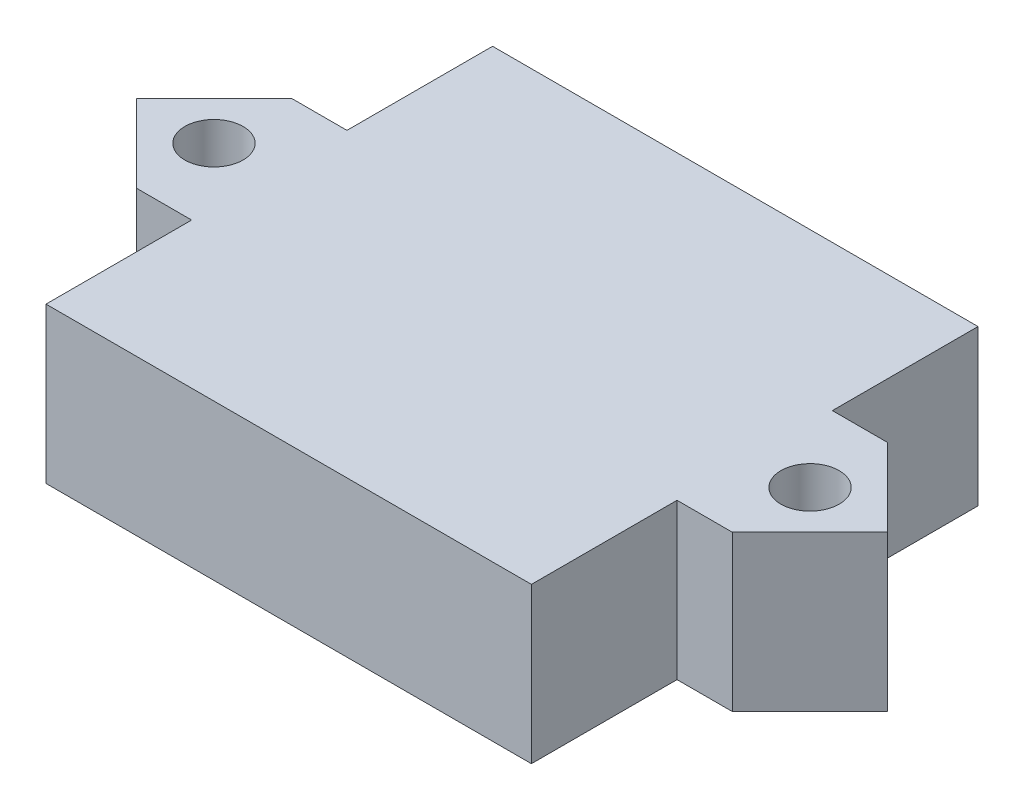
ISO-10303-21;
HEADER;
FILE_DESCRIPTION(('STEP AP214'),'2;1');
FILE_NAME('part.step','',(''),(''),'','','');
FILE_SCHEMA(('AUTOMOTIVE_DESIGN { 1 0 10303 214 1 1 1 1 }'));
ENDSEC;
DATA;
#1=APPLICATION_CONTEXT('core data for automotive mechanical design processes');
#2=APPLICATION_PROTOCOL_DEFINITION('international standard','automotive_design',2000,#1);
#3=PRODUCT_CONTEXT('',#1,'mechanical');
#4=PRODUCT('Part','Part','',(#3));
#5=PRODUCT_RELATED_PRODUCT_CATEGORY('part','',(#4));
#6=PRODUCT_DEFINITION_FORMATION('','',#4);
#7=PRODUCT_DEFINITION_CONTEXT('part definition',#1,'design');
#8=PRODUCT_DEFINITION('design','',#6,#7);
#9=PRODUCT_DEFINITION_SHAPE('','',#8);
#10=(LENGTH_UNIT() NAMED_UNIT(*) SI_UNIT(.MILLI.,.METRE.));
#11=(NAMED_UNIT(*) PLANE_ANGLE_UNIT() SI_UNIT($,.RADIAN.));
#12=(NAMED_UNIT(*) SI_UNIT($,.STERADIAN.) SOLID_ANGLE_UNIT());
#13=UNCERTAINTY_MEASURE_WITH_UNIT(LENGTH_MEASURE(1.E-05),#10,'distance_accuracy_value','');
#14=(GEOMETRIC_REPRESENTATION_CONTEXT(3) GLOBAL_UNCERTAINTY_ASSIGNED_CONTEXT((#13)) GLOBAL_UNIT_ASSIGNED_CONTEXT((#10,
#11,#12)) REPRESENTATION_CONTEXT('',''));
#15=CARTESIAN_POINT('',(0.,0.,0.));
#16=DIRECTION('',(0.,0.,1.));
#17=DIRECTION('',(1.,0.,0.));
#18=AXIS2_PLACEMENT_3D('',#15,#16,#17);
#19=CARTESIAN_POINT('',(0.,8.,0.));
#20=DIRECTION('',(0.,1.,0.));
#21=DIRECTION('',(0.,0.,1.));
#22=AXIS2_PLACEMENT_3D('',#19,#20,#21);
#23=PLANE('',#22);
#24=CARTESIAN_POINT('',(-15.35,8.,0.));
#25=DIRECTION('',(0.,1.,0.));
#26=DIRECTION('',(0.,0.,1.));
#27=AXIS2_PLACEMENT_3D('',#24,#25,#26);
#28=CIRCLE('',#27,1.5);
#29=CARTESIAN_POINT('',(-15.35,8.,1.5));
#30=VERTEX_POINT('',#29);
#31=EDGE_CURVE('E179',#30,#30,#28,.T.);
#32=ORIENTED_EDGE('',*,*,#31,.F.);
#33=EDGE_LOOP('',(#32));
#34=FACE_BOUND('',#33,.T.);
#35=DIRECTION('',(-0.707106781186548,0.,0.707106781186547));
#36=VECTOR('',#35,1.);
#37=CARTESIAN_POINT('',(-15.35,8.,-4.));
#38=LINE('',#37,#36);
#39=CARTESIAN_POINT('',(-15.35,8.,-4.));
#40=VERTEX_POINT('',#39);
#41=CARTESIAN_POINT('',(-19.35,8.,0.));
#42=VERTEX_POINT('',#41);
#43=EDGE_CURVE('E203',#40,#42,#38,.T.);
#44=ORIENTED_EDGE('',*,*,#43,.T.);
#45=DIRECTION('',(0.707106781186548,0.,0.707106781186547));
#46=VECTOR('',#45,1.);
#47=CARTESIAN_POINT('',(-19.35,8.,0.));
#48=LINE('',#47,#46);
#49=CARTESIAN_POINT('',(-15.35,8.,4.));
#50=VERTEX_POINT('',#49);
#51=EDGE_CURVE('E239',#42,#50,#48,.T.);
#52=ORIENTED_EDGE('',*,*,#51,.T.);
#53=DIRECTION('',(1.,0.,0.));
#54=VECTOR('',#53,1.);
#55=CARTESIAN_POINT('',(-15.35,8.,4.));
#56=LINE('',#55,#54);
#57=CARTESIAN_POINT('',(-12.5,8.,4.));
#58=VERTEX_POINT('',#57);
#59=EDGE_CURVE('E233',#50,#58,#56,.T.);
#60=ORIENTED_EDGE('',*,*,#59,.T.);
#61=DIRECTION('',(0.,0.,1.));
#62=VECTOR('',#61,1.);
#63=CARTESIAN_POINT('',(-12.5,8.,4.));
#64=LINE('',#63,#62);
#65=CARTESIAN_POINT('',(-12.5,8.,11.5));
#66=VERTEX_POINT('',#65);
#67=EDGE_CURVE('E231',#58,#66,#64,.T.);
#68=ORIENTED_EDGE('',*,*,#67,.T.);
#69=DIRECTION('',(1.,0.,0.));
#70=VECTOR('',#69,1.);
#71=CARTESIAN_POINT('',(-12.5,8.,11.5));
#72=LINE('',#71,#70);
#73=CARTESIAN_POINT('',(12.5,8.,11.5));
#74=VERTEX_POINT('',#73);
#75=EDGE_CURVE('E121',#66,#74,#72,.T.);
#76=ORIENTED_EDGE('',*,*,#75,.T.);
#77=DIRECTION('',(0.,0.,-1.));
#78=VECTOR('',#77,1.);
#79=CARTESIAN_POINT('',(12.5,8.,12.5));
#80=LINE('',#79,#78);
#81=CARTESIAN_POINT('',(12.5,8.,4.));
#82=VERTEX_POINT('',#81);
#83=EDGE_CURVE('E130',#74,#82,#80,.T.);
#84=ORIENTED_EDGE('',*,*,#83,.T.);
#85=DIRECTION('',(1.,0.,0.));
#86=VECTOR('',#85,1.);
#87=CARTESIAN_POINT('',(12.5,8.,4.));
#88=LINE('',#87,#86);
#89=CARTESIAN_POINT('',(15.35,8.,4.));
#90=VERTEX_POINT('',#89);
#91=EDGE_CURVE('E232',#82,#90,#88,.T.);
#92=ORIENTED_EDGE('',*,*,#91,.T.);
#93=DIRECTION('',(0.707106781186548,0.,-0.707106781186547));
#94=VECTOR('',#93,1.);
#95=CARTESIAN_POINT('',(15.35,8.,4.));
#96=LINE('',#95,#94);
#97=CARTESIAN_POINT('',(19.35,8.,0.));
#98=VERTEX_POINT('',#97);
#99=EDGE_CURVE('E244',#90,#98,#96,.T.);
#100=ORIENTED_EDGE('',*,*,#99,.T.);
#101=DIRECTION('',(-0.707106781186548,0.,-0.707106781186547));
#102=VECTOR('',#101,1.);
#103=CARTESIAN_POINT('',(19.35,8.,0.));
#104=LINE('',#103,#102);
#105=CARTESIAN_POINT('',(15.35,8.,-4.));
#106=VERTEX_POINT('',#105);
#107=EDGE_CURVE('E150',#98,#106,#104,.T.);
#108=ORIENTED_EDGE('',*,*,#107,.T.);
#109=DIRECTION('',(-1.,0.,0.));
#110=VECTOR('',#109,1.);
#111=CARTESIAN_POINT('',(15.35,8.,-4.));
#112=LINE('',#111,#110);
#113=CARTESIAN_POINT('',(12.5,8.,-4.));
#114=VERTEX_POINT('',#113);
#115=EDGE_CURVE('E140',#106,#114,#112,.T.);
#116=ORIENTED_EDGE('',*,*,#115,.T.);
#117=DIRECTION('',(0.,0.,-1.));
#118=VECTOR('',#117,1.);
#119=CARTESIAN_POINT('',(12.5,8.,-4.));
#120=LINE('',#119,#118);
#121=CARTESIAN_POINT('',(12.5,8.,-11.5));
#122=VERTEX_POINT('',#121);
#123=EDGE_CURVE('E145',#114,#122,#120,.T.);
#124=ORIENTED_EDGE('',*,*,#123,.T.);
#125=DIRECTION('',(-1.,0.,0.));
#126=VECTOR('',#125,1.);
#127=CARTESIAN_POINT('',(12.5,8.,-11.5));
#128=LINE('',#127,#126);
#129=CARTESIAN_POINT('',(-12.5,8.,-11.5));
#130=VERTEX_POINT('',#129);
#131=EDGE_CURVE('E164',#122,#130,#128,.T.);
#132=ORIENTED_EDGE('',*,*,#131,.T.);
#133=DIRECTION('',(0.,0.,1.));
#134=VECTOR('',#133,1.);
#135=CARTESIAN_POINT('',(-12.5,8.,-12.5));
#136=LINE('',#135,#134);
#137=CARTESIAN_POINT('',(-12.5,8.,-4.));
#138=VERTEX_POINT('',#137);
#139=EDGE_CURVE('E170',#130,#138,#136,.T.);
#140=ORIENTED_EDGE('',*,*,#139,.T.);
#141=DIRECTION('',(-1.,0.,0.));
#142=VECTOR('',#141,1.);
#143=CARTESIAN_POINT('',(-12.5,8.,-4.));
#144=LINE('',#143,#142);
#145=EDGE_CURVE('E63',#138,#40,#144,.T.);
#146=ORIENTED_EDGE('',*,*,#145,.T.);
#147=EDGE_LOOP('',(#44,#52,#60,#68,#76,#84,#92,#100,#108,#116,#124,#132,#140,#146));
#148=FACE_BOUND('',#147,.T.);
#149=CARTESIAN_POINT('',(15.35,8.,0.));
#150=DIRECTION('',(0.,1.,0.));
#151=DIRECTION('',(0.,0.,1.));
#152=AXIS2_PLACEMENT_3D('',#149,#150,#151);
#153=CIRCLE('',#152,1.5);
#154=CARTESIAN_POINT('',(15.35,8.,1.5));
#155=VERTEX_POINT('',#154);
#156=EDGE_CURVE('E283',#155,#155,#153,.T.);
#157=ORIENTED_EDGE('',*,*,#156,.F.);
#158=EDGE_LOOP('',(#157));
#159=FACE_BOUND('',#158,.T.);
#160=ADVANCED_FACE('F45',(#34,#148,#159),#23,.T.);
#161=CARTESIAN_POINT('',(0.,0.,0.));
#162=DIRECTION('',(0.,1.,0.));
#163=DIRECTION('',(0.,0.,1.));
#164=AXIS2_PLACEMENT_3D('',#161,#162,#163);
#165=PLANE('',#164);
#166=DIRECTION('',(-0.707106781186548,0.,0.707106781186547));
#167=VECTOR('',#166,1.);
#168=CARTESIAN_POINT('',(-15.35,0.,-4.));
#169=LINE('',#168,#167);
#170=CARTESIAN_POINT('',(-15.35,0.,-4.));
#171=VERTEX_POINT('',#170);
#172=CARTESIAN_POINT('',(-19.35,0.,0.));
#173=VERTEX_POINT('',#172);
#174=EDGE_CURVE('E174',#171,#173,#169,.T.);
#175=ORIENTED_EDGE('',*,*,#174,.F.);
#176=DIRECTION('',(-1.,0.,0.));
#177=VECTOR('',#176,1.);
#178=CARTESIAN_POINT('',(-12.5,0.,-4.));
#179=LINE('',#178,#177);
#180=CARTESIAN_POINT('',(-12.5,0.,-4.));
#181=VERTEX_POINT('',#180);
#182=EDGE_CURVE('E200',#181,#171,#179,.T.);
#183=ORIENTED_EDGE('',*,*,#182,.F.);
#184=DIRECTION('',(0.,0.,1.));
#185=VECTOR('',#184,1.);
#186=CARTESIAN_POINT('',(-12.5,0.,-12.5));
#187=LINE('',#186,#185);
#188=CARTESIAN_POINT('',(-12.5,0.,-11.5));
#189=VERTEX_POINT('',#188);
#190=EDGE_CURVE('E197',#189,#181,#187,.T.);
#191=ORIENTED_EDGE('',*,*,#190,.F.);
#192=DIRECTION('',(-1.,0.,0.));
#193=VECTOR('',#192,1.);
#194=CARTESIAN_POINT('',(12.5,0.,-11.5));
#195=LINE('',#194,#193);
#196=CARTESIAN_POINT('',(12.5,0.,-11.5));
#197=VERTEX_POINT('',#196);
#198=EDGE_CURVE('E198',#197,#189,#195,.T.);
#199=ORIENTED_EDGE('',*,*,#198,.F.);
#200=DIRECTION('',(0.,0.,-1.));
#201=VECTOR('',#200,1.);
#202=CARTESIAN_POINT('',(12.5,0.,-4.));
#203=LINE('',#202,#201);
#204=CARTESIAN_POINT('',(12.5,0.,-4.));
#205=VERTEX_POINT('',#204);
#206=EDGE_CURVE('E193',#205,#197,#203,.T.);
#207=ORIENTED_EDGE('',*,*,#206,.F.);
#208=DIRECTION('',(-1.,0.,0.));
#209=VECTOR('',#208,1.);
#210=CARTESIAN_POINT('',(15.35,0.,-4.));
#211=LINE('',#210,#209);
#212=CARTESIAN_POINT('',(15.35,0.,-4.));
#213=VERTEX_POINT('',#212);
#214=EDGE_CURVE('E156',#213,#205,#211,.T.);
#215=ORIENTED_EDGE('',*,*,#214,.F.);
#216=DIRECTION('',(-0.707106781186548,0.,-0.707106781186547));
#217=VECTOR('',#216,1.);
#218=CARTESIAN_POINT('',(19.35,0.,0.));
#219=LINE('',#218,#217);
#220=CARTESIAN_POINT('',(19.35,0.,0.));
#221=VERTEX_POINT('',#220);
#222=EDGE_CURVE('E191',#221,#213,#219,.T.);
#223=ORIENTED_EDGE('',*,*,#222,.F.);
#224=DIRECTION('',(0.707106781186548,0.,-0.707106781186547));
#225=VECTOR('',#224,1.);
#226=CARTESIAN_POINT('',(15.35,0.,4.));
#227=LINE('',#226,#225);
#228=CARTESIAN_POINT('',(15.35,0.,4.));
#229=VERTEX_POINT('',#228);
#230=EDGE_CURVE('E189',#229,#221,#227,.T.);
#231=ORIENTED_EDGE('',*,*,#230,.F.);
#232=DIRECTION('',(1.,0.,0.));
#233=VECTOR('',#232,1.);
#234=CARTESIAN_POINT('',(12.5,0.,4.));
#235=LINE('',#234,#233);
#236=CARTESIAN_POINT('',(12.5,0.,4.));
#237=VERTEX_POINT('',#236);
#238=EDGE_CURVE('E190',#237,#229,#235,.T.);
#239=ORIENTED_EDGE('',*,*,#238,.F.);
#240=DIRECTION('',(0.,0.,-1.));
#241=VECTOR('',#240,1.);
#242=CARTESIAN_POINT('',(12.5,0.,12.5));
#243=LINE('',#242,#241);
#244=CARTESIAN_POINT('',(12.5,0.,11.5));
#245=VERTEX_POINT('',#244);
#246=EDGE_CURVE('E183',#245,#237,#243,.T.);
#247=ORIENTED_EDGE('',*,*,#246,.F.);
#248=DIRECTION('',(1.,0.,0.));
#249=VECTOR('',#248,1.);
#250=CARTESIAN_POINT('',(-12.5,0.,11.5));
#251=LINE('',#250,#249);
#252=CARTESIAN_POINT('',(-12.5,0.,11.5));
#253=VERTEX_POINT('',#252);
#254=EDGE_CURVE('E184',#253,#245,#251,.T.);
#255=ORIENTED_EDGE('',*,*,#254,.F.);
#256=DIRECTION('',(0.,0.,1.));
#257=VECTOR('',#256,1.);
#258=CARTESIAN_POINT('',(-12.5,0.,4.));
#259=LINE('',#258,#257);
#260=CARTESIAN_POINT('',(-12.5,0.,4.));
#261=VERTEX_POINT('',#260);
#262=EDGE_CURVE('E185',#261,#253,#259,.T.);
#263=ORIENTED_EDGE('',*,*,#262,.F.);
#264=DIRECTION('',(1.,0.,0.));
#265=VECTOR('',#264,1.);
#266=CARTESIAN_POINT('',(-15.35,0.,4.));
#267=LINE('',#266,#265);
#268=CARTESIAN_POINT('',(-15.35,0.,4.));
#269=VERTEX_POINT('',#268);
#270=EDGE_CURVE('E180',#269,#261,#267,.T.);
#271=ORIENTED_EDGE('',*,*,#270,.F.);
#272=DIRECTION('',(0.707106781186548,0.,0.707106781186547));
#273=VECTOR('',#272,1.);
#274=CARTESIAN_POINT('',(-19.35,0.,0.));
#275=LINE('',#274,#273);
#276=EDGE_CURVE('E177',#173,#269,#275,.T.);
#277=ORIENTED_EDGE('',*,*,#276,.F.);
#278=EDGE_LOOP('',(#175,#183,#191,#199,#207,#215,#223,#231,#239,#247,#255,#263,#271,#277));
#279=FACE_BOUND('',#278,.T.);
#280=CARTESIAN_POINT('',(-15.35,0.,0.));
#281=DIRECTION('',(0.,1.,0.));
#282=DIRECTION('',(0.,0.,1.));
#283=AXIS2_PLACEMENT_3D('',#280,#281,#282);
#284=CIRCLE('',#283,1.5);
#285=CARTESIAN_POINT('',(-15.35,0.,1.5));
#286=VERTEX_POINT('',#285);
#287=EDGE_CURVE('E279',#286,#286,#284,.T.);
#288=ORIENTED_EDGE('',*,*,#287,.T.);
#289=EDGE_LOOP('',(#288));
#290=FACE_BOUND('',#289,.T.);
#291=CARTESIAN_POINT('',(15.35,0.,0.));
#292=DIRECTION('',(0.,1.,0.));
#293=DIRECTION('',(0.,0.,1.));
#294=AXIS2_PLACEMENT_3D('',#291,#292,#293);
#295=CIRCLE('',#294,1.5);
#296=CARTESIAN_POINT('',(15.35,0.,1.5));
#297=VERTEX_POINT('',#296);
#298=EDGE_CURVE('E284',#297,#297,#295,.T.);
#299=ORIENTED_EDGE('',*,*,#298,.T.);
#300=EDGE_LOOP('',(#299));
#301=FACE_BOUND('',#300,.T.);
#302=ADVANCED_FACE('F260',(#279,#290,#301),#165,.F.);
#303=CARTESIAN_POINT('',(-15.35,8.,-4.));
#304=DIRECTION('',(0.707106781186547,0.,0.707106781186548));
#305=DIRECTION('',(0.707106781186548,0.,-0.707106781186547));
#306=AXIS2_PLACEMENT_3D('',#303,#304,#305);
#307=PLANE('',#306);
#308=ORIENTED_EDGE('',*,*,#174,.T.);
#309=DIRECTION('',(0.,-1.,0.));
#310=VECTOR('',#309,1.);
#311=CARTESIAN_POINT('',(-19.35,8.,0.));
#312=LINE('',#311,#310);
#313=EDGE_CURVE('E12',#42,#173,#312,.T.);
#314=ORIENTED_EDGE('',*,*,#313,.F.);
#315=ORIENTED_EDGE('',*,*,#43,.F.);
#316=DIRECTION('',(0.,-1.,0.));
#317=VECTOR('',#316,1.);
#318=CARTESIAN_POINT('',(-15.35,8.,-4.));
#319=LINE('',#318,#317);
#320=EDGE_CURVE('E171',#40,#171,#319,.T.);
#321=ORIENTED_EDGE('',*,*,#320,.T.);
#322=EDGE_LOOP('',(#308,#314,#315,#321));
#323=FACE_BOUND('',#322,.T.);
#324=ADVANCED_FACE('F273',(#323),#307,.F.);
#325=CARTESIAN_POINT('',(-19.35,8.,0.));
#326=DIRECTION('',(0.707106781186547,0.,-0.707106781186548));
#327=DIRECTION('',(-0.707106781186548,0.,-0.707106781186547));
#328=AXIS2_PLACEMENT_3D('',#325,#326,#327);
#329=PLANE('',#328);
#330=ORIENTED_EDGE('',*,*,#276,.T.);
#331=DIRECTION('',(0.,-1.,0.));
#332=VECTOR('',#331,1.);
#333=CARTESIAN_POINT('',(-15.35,8.,4.));
#334=LINE('',#333,#332);
#335=EDGE_CURVE('E55',#50,#269,#334,.T.);
#336=ORIENTED_EDGE('',*,*,#335,.F.);
#337=ORIENTED_EDGE('',*,*,#51,.F.);
#338=ORIENTED_EDGE('',*,*,#313,.T.);
#339=EDGE_LOOP('',(#330,#336,#337,#338));
#340=FACE_BOUND('',#339,.T.);
#341=ADVANCED_FACE('F335',(#340),#329,.F.);
#342=CARTESIAN_POINT('',(-15.35,8.,4.));
#343=DIRECTION('',(0.,0.,-1.));
#344=DIRECTION('',(-1.,0.,0.));
#345=AXIS2_PLACEMENT_3D('',#342,#343,#344);
#346=PLANE('',#345);
#347=ORIENTED_EDGE('',*,*,#270,.T.);
#348=DIRECTION('',(0.,-1.,0.));
#349=VECTOR('',#348,1.);
#350=CARTESIAN_POINT('',(-12.5,8.,4.));
#351=LINE('',#350,#349);
#352=EDGE_CURVE('E217',#58,#261,#351,.T.);
#353=ORIENTED_EDGE('',*,*,#352,.F.);
#354=ORIENTED_EDGE('',*,*,#59,.F.);
#355=ORIENTED_EDGE('',*,*,#335,.T.);
#356=EDGE_LOOP('',(#347,#353,#354,#355));
#357=FACE_BOUND('',#356,.T.);
#358=ADVANCED_FACE('F327',(#357),#346,.F.);
#359=CARTESIAN_POINT('',(-12.5,8.,4.));
#360=DIRECTION('',(1.,0.,0.));
#361=DIRECTION('',(0.,0.,-1.));
#362=AXIS2_PLACEMENT_3D('',#359,#360,#361);
#363=PLANE('',#362);
#364=ORIENTED_EDGE('',*,*,#262,.T.);
#365=DIRECTION('',(0.,-1.,0.));
#366=VECTOR('',#365,1.);
#367=CARTESIAN_POINT('',(-12.5,8.,11.5));
#368=LINE('',#367,#366);
#369=EDGE_CURVE('E222',#66,#253,#368,.T.);
#370=ORIENTED_EDGE('',*,*,#369,.F.);
#371=ORIENTED_EDGE('',*,*,#67,.F.);
#372=ORIENTED_EDGE('',*,*,#352,.T.);
#373=EDGE_LOOP('',(#364,#370,#371,#372));
#374=FACE_BOUND('',#373,.T.);
#375=ADVANCED_FACE('F324',(#374),#363,.F.);
#376=CARTESIAN_POINT('',(-12.5,8.,11.5));
#377=DIRECTION('',(0.,0.,-1.));
#378=DIRECTION('',(-1.,0.,0.));
#379=AXIS2_PLACEMENT_3D('',#376,#377,#378);
#380=PLANE('',#379);
#381=ORIENTED_EDGE('',*,*,#254,.T.);
#382=DIRECTION('',(0.,-1.,0.));
#383=VECTOR('',#382,1.);
#384=CARTESIAN_POINT('',(12.5,8.,11.5));
#385=LINE('',#384,#383);
#386=EDGE_CURVE('E46',#74,#245,#385,.T.);
#387=ORIENTED_EDGE('',*,*,#386,.F.);
#388=ORIENTED_EDGE('',*,*,#75,.F.);
#389=ORIENTED_EDGE('',*,*,#369,.T.);
#390=EDGE_LOOP('',(#381,#387,#388,#389));
#391=FACE_BOUND('',#390,.T.);
#392=ADVANCED_FACE('F42',(#391),#380,.F.);
#393=CARTESIAN_POINT('',(12.5,8.,12.5));
#394=DIRECTION('',(-1.,0.,0.));
#395=DIRECTION('',(0.,0.,1.));
#396=AXIS2_PLACEMENT_3D('',#393,#394,#395);
#397=PLANE('',#396);
#398=ORIENTED_EDGE('',*,*,#246,.T.);
#399=DIRECTION('',(0.,-1.,0.));
#400=VECTOR('',#399,1.);
#401=CARTESIAN_POINT('',(12.5,8.,4.));
#402=LINE('',#401,#400);
#403=EDGE_CURVE('E214',#82,#237,#402,.T.);
#404=ORIENTED_EDGE('',*,*,#403,.F.);
#405=ORIENTED_EDGE('',*,*,#83,.F.);
#406=ORIENTED_EDGE('',*,*,#386,.T.);
#407=EDGE_LOOP('',(#398,#404,#405,#406));
#408=FACE_BOUND('',#407,.T.);
#409=ADVANCED_FACE('F319',(#408),#397,.F.);
#410=CARTESIAN_POINT('',(12.5,8.,4.));
#411=DIRECTION('',(0.,0.,-1.));
#412=DIRECTION('',(-1.,0.,0.));
#413=AXIS2_PLACEMENT_3D('',#410,#411,#412);
#414=PLANE('',#413);
#415=ORIENTED_EDGE('',*,*,#238,.T.);
#416=DIRECTION('',(0.,-1.,0.));
#417=VECTOR('',#416,1.);
#418=CARTESIAN_POINT('',(15.35,8.,4.));
#419=LINE('',#418,#417);
#420=EDGE_CURVE('E215',#90,#229,#419,.T.);
#421=ORIENTED_EDGE('',*,*,#420,.F.);
#422=ORIENTED_EDGE('',*,*,#91,.F.);
#423=ORIENTED_EDGE('',*,*,#403,.T.);
#424=EDGE_LOOP('',(#415,#421,#422,#423));
#425=FACE_BOUND('',#424,.T.);
#426=ADVANCED_FACE('F320',(#425),#414,.F.);
#427=CARTESIAN_POINT('',(15.35,8.,4.));
#428=DIRECTION('',(-0.707106781186547,0.,-0.707106781186548));
#429=DIRECTION('',(-0.707106781186548,0.,0.707106781186547));
#430=AXIS2_PLACEMENT_3D('',#427,#428,#429);
#431=PLANE('',#430);
#432=ORIENTED_EDGE('',*,*,#230,.T.);
#433=DIRECTION('',(0.,-1.,0.));
#434=VECTOR('',#433,1.);
#435=CARTESIAN_POINT('',(19.35,8.,0.));
#436=LINE('',#435,#434);
#437=EDGE_CURVE('E207',#98,#221,#436,.T.);
#438=ORIENTED_EDGE('',*,*,#437,.F.);
#439=ORIENTED_EDGE('',*,*,#99,.F.);
#440=ORIENTED_EDGE('',*,*,#420,.T.);
#441=EDGE_LOOP('',(#432,#438,#439,#440));
#442=FACE_BOUND('',#441,.T.);
#443=ADVANCED_FACE('F250',(#442),#431,.F.);
#444=CARTESIAN_POINT('',(19.35,8.,0.));
#445=DIRECTION('',(-0.707106781186547,0.,0.707106781186548));
#446=DIRECTION('',(0.707106781186548,0.,0.707106781186547));
#447=AXIS2_PLACEMENT_3D('',#444,#445,#446);
#448=PLANE('',#447);
#449=ORIENTED_EDGE('',*,*,#222,.T.);
#450=DIRECTION('',(0.,-1.,0.));
#451=VECTOR('',#450,1.);
#452=CARTESIAN_POINT('',(15.35,8.,-4.));
#453=LINE('',#452,#451);
#454=EDGE_CURVE('E157',#106,#213,#453,.T.);
#455=ORIENTED_EDGE('',*,*,#454,.F.);
#456=ORIENTED_EDGE('',*,*,#107,.F.);
#457=ORIENTED_EDGE('',*,*,#437,.T.);
#458=EDGE_LOOP('',(#449,#455,#456,#457));
#459=FACE_BOUND('',#458,.T.);
#460=ADVANCED_FACE('F255',(#459),#448,.F.);
#461=CARTESIAN_POINT('',(15.35,8.,-4.));
#462=DIRECTION('',(0.,0.,1.));
#463=DIRECTION('',(1.,0.,0.));
#464=AXIS2_PLACEMENT_3D('',#461,#462,#463);
#465=PLANE('',#464);
#466=ORIENTED_EDGE('',*,*,#214,.T.);
#467=DIRECTION('',(0.,-1.,0.));
#468=VECTOR('',#467,1.);
#469=CARTESIAN_POINT('',(12.5,8.,-4.));
#470=LINE('',#469,#468);
#471=EDGE_CURVE('E153',#114,#205,#470,.T.);
#472=ORIENTED_EDGE('',*,*,#471,.F.);
#473=ORIENTED_EDGE('',*,*,#115,.F.);
#474=ORIENTED_EDGE('',*,*,#454,.T.);
#475=EDGE_LOOP('',(#466,#472,#473,#474));
#476=FACE_BOUND('',#475,.T.);
#477=ADVANCED_FACE('F152',(#476),#465,.F.);
#478=CARTESIAN_POINT('',(12.5,8.,-4.));
#479=DIRECTION('',(-1.,0.,0.));
#480=DIRECTION('',(0.,0.,1.));
#481=AXIS2_PLACEMENT_3D('',#478,#479,#480);
#482=PLANE('',#481);
#483=ORIENTED_EDGE('',*,*,#206,.T.);
#484=DIRECTION('',(0.,-1.,0.));
#485=VECTOR('',#484,1.);
#486=CARTESIAN_POINT('',(12.5,8.,-11.5));
#487=LINE('',#486,#485);
#488=EDGE_CURVE('E159',#122,#197,#487,.T.);
#489=ORIENTED_EDGE('',*,*,#488,.F.);
#490=ORIENTED_EDGE('',*,*,#123,.F.);
#491=ORIENTED_EDGE('',*,*,#471,.T.);
#492=EDGE_LOOP('',(#483,#489,#490,#491));
#493=FACE_BOUND('',#492,.T.);
#494=ADVANCED_FACE('F165',(#493),#482,.F.);
#495=CARTESIAN_POINT('',(12.5,8.,-11.5));
#496=DIRECTION('',(0.,0.,1.));
#497=DIRECTION('',(1.,0.,0.));
#498=AXIS2_PLACEMENT_3D('',#495,#496,#497);
#499=PLANE('',#498);
#500=ORIENTED_EDGE('',*,*,#198,.T.);
#501=DIRECTION('',(0.,-1.,0.));
#502=VECTOR('',#501,1.);
#503=CARTESIAN_POINT('',(-12.5,8.,-11.5));
#504=LINE('',#503,#502);
#505=EDGE_CURVE('E206',#130,#189,#504,.T.);
#506=ORIENTED_EDGE('',*,*,#505,.F.);
#507=ORIENTED_EDGE('',*,*,#131,.F.);
#508=ORIENTED_EDGE('',*,*,#488,.T.);
#509=EDGE_LOOP('',(#500,#506,#507,#508));
#510=FACE_BOUND('',#509,.T.);
#511=ADVANCED_FACE('F265',(#510),#499,.F.);
#512=CARTESIAN_POINT('',(-12.5,8.,-12.5));
#513=DIRECTION('',(1.,0.,0.));
#514=DIRECTION('',(0.,0.,-1.));
#515=AXIS2_PLACEMENT_3D('',#512,#513,#514);
#516=PLANE('',#515);
#517=ORIENTED_EDGE('',*,*,#190,.T.);
#518=DIRECTION('',(0.,-1.,0.));
#519=VECTOR('',#518,1.);
#520=CARTESIAN_POINT('',(-12.5,8.,-4.));
#521=LINE('',#520,#519);
#522=EDGE_CURVE('E204',#138,#181,#521,.T.);
#523=ORIENTED_EDGE('',*,*,#522,.F.);
#524=ORIENTED_EDGE('',*,*,#139,.F.);
#525=ORIENTED_EDGE('',*,*,#505,.T.);
#526=EDGE_LOOP('',(#517,#523,#524,#525));
#527=FACE_BOUND('',#526,.T.);
#528=ADVANCED_FACE('F270',(#527),#516,.F.);
#529=CARTESIAN_POINT('',(-12.5,8.,-4.));
#530=DIRECTION('',(0.,0.,1.));
#531=DIRECTION('',(1.,0.,0.));
#532=AXIS2_PLACEMENT_3D('',#529,#530,#531);
#533=PLANE('',#532);
#534=ORIENTED_EDGE('',*,*,#182,.T.);
#535=ORIENTED_EDGE('',*,*,#320,.F.);
#536=ORIENTED_EDGE('',*,*,#145,.F.);
#537=ORIENTED_EDGE('',*,*,#522,.T.);
#538=EDGE_LOOP('',(#534,#535,#536,#537));
#539=FACE_BOUND('',#538,.T.);
#540=ADVANCED_FACE('F269',(#539),#533,.F.);
#541=CARTESIAN_POINT('',(-15.35,8.,0.));
#542=DIRECTION('',(0.,-1.,0.));
#543=DIRECTION('',(0.,0.,-1.));
#544=AXIS2_PLACEMENT_3D('',#541,#542,#543);
#545=CYLINDRICAL_SURFACE('',#544,1.5);
#546=ORIENTED_EDGE('',*,*,#31,.T.);
#547=EDGE_LOOP('',(#546));
#548=FACE_BOUND('',#547,.T.);
#549=ORIENTED_EDGE('',*,*,#287,.F.);
#550=EDGE_LOOP('',(#549));
#551=FACE_BOUND('',#550,.T.);
#552=ADVANCED_FACE('F302',(#548,#551),#545,.F.);
#553=CARTESIAN_POINT('',(15.35,8.,0.));
#554=DIRECTION('',(0.,-1.,0.));
#555=DIRECTION('',(0.,0.,-1.));
#556=AXIS2_PLACEMENT_3D('',#553,#554,#555);
#557=CYLINDRICAL_SURFACE('',#556,1.5);
#558=ORIENTED_EDGE('',*,*,#156,.T.);
#559=EDGE_LOOP('',(#558));
#560=FACE_BOUND('',#559,.T.);
#561=ORIENTED_EDGE('',*,*,#298,.F.);
#562=EDGE_LOOP('',(#561));
#563=FACE_BOUND('',#562,.T.);
#564=ADVANCED_FACE('F290',(#560,#563),#557,.F.);
#565=CLOSED_SHELL('',(#160,#302,#324,#341,#358,#375,#392,#409,#426,#443,#460,#477,#494,#511,
#528,#540,#552,#564));
#566=MANIFOLD_SOLID_BREP('B2',#565);
#567=ADVANCED_BREP_SHAPE_REPRESENTATION('',(#18,#566),#14);
#568=SHAPE_DEFINITION_REPRESENTATION(#9,#567);
ENDSEC;
END-ISO-10303-21;
